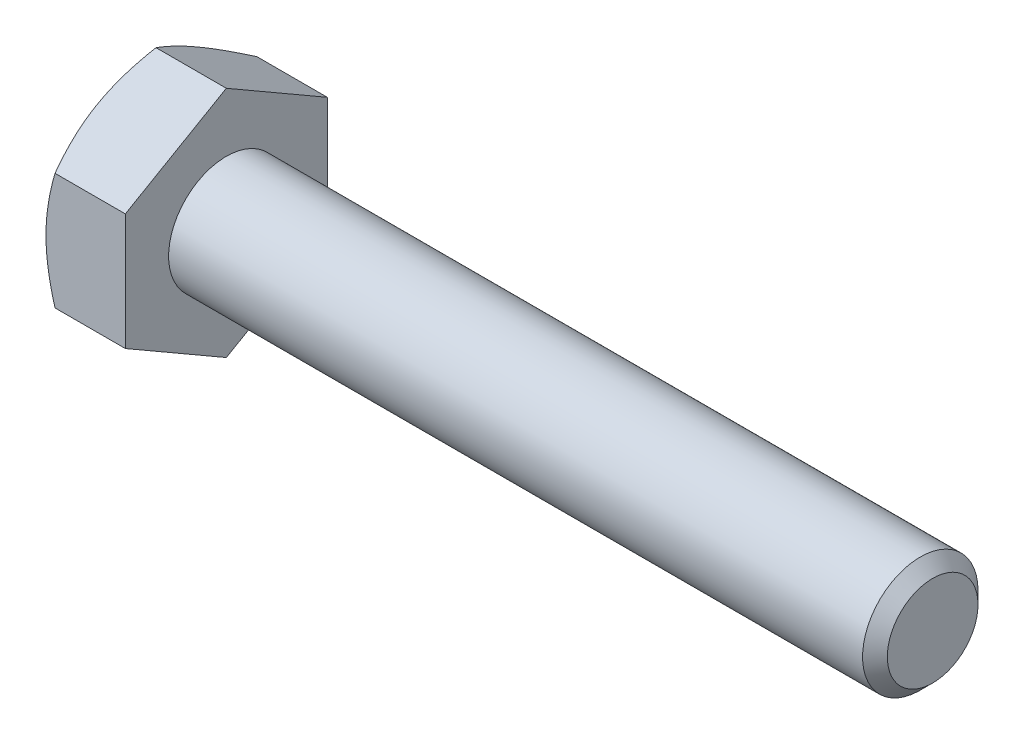
ISO-10303-21;
HEADER;
FILE_DESCRIPTION(('STEP AP214'),'2;1');
FILE_NAME('part.step','',(''),(''),'','','');
FILE_SCHEMA(('AUTOMOTIVE_DESIGN { 1 0 10303 214 1 1 1 1 }'));
ENDSEC;
DATA;
#1=APPLICATION_CONTEXT('core data for automotive mechanical design processes');
#2=APPLICATION_PROTOCOL_DEFINITION('international standard','automotive_design',2000,#1);
#3=PRODUCT_CONTEXT('',#1,'mechanical');
#4=PRODUCT('Part','Part','',(#3));
#5=PRODUCT_RELATED_PRODUCT_CATEGORY('part','',(#4));
#6=PRODUCT_DEFINITION_FORMATION('','',#4);
#7=PRODUCT_DEFINITION_CONTEXT('part definition',#1,'design');
#8=PRODUCT_DEFINITION('design','',#6,#7);
#9=PRODUCT_DEFINITION_SHAPE('','',#8);
#10=(LENGTH_UNIT() NAMED_UNIT(*) SI_UNIT(.MILLI.,.METRE.));
#11=(NAMED_UNIT(*) PLANE_ANGLE_UNIT() SI_UNIT($,.RADIAN.));
#12=(NAMED_UNIT(*) SI_UNIT($,.STERADIAN.) SOLID_ANGLE_UNIT());
#13=UNCERTAINTY_MEASURE_WITH_UNIT(LENGTH_MEASURE(1.E-05),#10,'distance_accuracy_value','');
#14=(GEOMETRIC_REPRESENTATION_CONTEXT(3) GLOBAL_UNCERTAINTY_ASSIGNED_CONTEXT((#13)) GLOBAL_UNIT_ASSIGNED_CONTEXT((#10,
#11,#12)) REPRESENTATION_CONTEXT('',''));
#15=CARTESIAN_POINT('',(0.,0.,0.));
#16=DIRECTION('',(0.,0.,1.));
#17=DIRECTION('',(1.,0.,0.));
#18=AXIS2_PLACEMENT_3D('',#15,#16,#17);
#19=CARTESIAN_POINT('',(-21.6138125,-3.20790243318485,5.55625));
#20=DIRECTION('',(0.,0.,-1.));
#21=DIRECTION('',(0.,1.,0.));
#22=AXIS2_PLACEMENT_3D('',#19,#20,#21);
#23=PLANE('',#22);
#24=CARTESIAN_POINT('',(-18.8403750574616,-8.74399028271723,5.55625));
#25=CARTESIAN_POINT('',(-18.9591476439003,-8.50018624433214,5.55625));
#26=CARTESIAN_POINT('',(-19.0768174877412,-8.25583594838017,5.55625));
#27=CARTESIAN_POINT('',(-19.3093338302931,-7.76575276181023,5.55625));
#28=CARTESIAN_POINT('',(-19.424179907504,-7.5200196714312,5.55625));
#29=CARTESIAN_POINT('',(-19.6509815650906,-7.02567502758554,5.55625));
#30=CARTESIAN_POINT('',(-19.7629190754759,-6.77705515601886,5.55625));
#31=CARTESIAN_POINT('',(-19.9823791438231,-6.2778816135969,5.55625));
#32=CARTESIAN_POINT('',(-20.0899019023311,-6.02732803119864,5.55625));
#33=CARTESIAN_POINT('',(-20.302906896146,-5.51539046667091,5.55625));
#34=CARTESIAN_POINT('',(-20.4081977000269,-5.25392641272659,5.55625));
#35=CARTESIAN_POINT('',(-20.6111139851458,-4.72798657849261,5.55625));
#36=CARTESIAN_POINT('',(-20.7087386244234,-4.46351047103702,5.55625));
#37=CARTESIAN_POINT('',(-20.8938532154484,-3.93158169041599,5.55625));
#38=CARTESIAN_POINT('',(-20.9813626154158,-3.66413585057298,5.55625));
#39=CARTESIAN_POINT('',(-21.1435224423586,-3.12540698347401,5.55625));
#40=CARTESIAN_POINT('',(-21.218176786064,-2.85412515234023,5.55625));
#41=CARTESIAN_POINT('',(-21.3507361578849,-2.30908269853905,5.55625));
#42=CARTESIAN_POINT('',(-21.4087346690236,-2.03534517245375,5.55625));
#43=CARTESIAN_POINT('',(-21.5047733322196,-1.48429809984412,5.55625));
#44=CARTESIAN_POINT('',(-21.542815646564,-1.20698894364918,5.55625));
#45=CARTESIAN_POINT('',(-21.5823928026956,-0.791294728945891,5.55625));
#46=CARTESIAN_POINT('',(-21.592658902021,-0.653708209357037,5.55625));
#47=CARTESIAN_POINT('',(-21.607362187288,-0.378228688137559,5.55625));
#48=CARTESIAN_POINT('',(-21.6117999263983,-0.240335716836742,5.55625));
#49=CARTESIAN_POINT('',(-21.6147354775687,0.0355251316508551,5.55625));
#50=CARTESIAN_POINT('',(-21.6132327727923,0.173493014310985,5.55625));
#51=CARTESIAN_POINT('',(-21.6043265100424,0.449228447033502,5.55625));
#52=CARTESIAN_POINT('',(-21.5969231814189,0.586996004673774,5.55625));
#53=CARTESIAN_POINT('',(-21.5724869355163,0.914267817860307,5.55625));
#54=CARTESIAN_POINT('',(-21.5528672237309,1.10358331302688,5.55625));
#55=CARTESIAN_POINT('',(-21.5035268119308,1.48088314390515,5.55625));
#56=CARTESIAN_POINT('',(-21.4738048473206,1.66886730995275,5.55625));
#57=CARTESIAN_POINT('',(-21.3710555513119,2.23056094001761,5.55625));
#58=CARTESIAN_POINT('',(-21.2844606125147,2.60182550045218,5.55625));
#59=CARTESIAN_POINT('',(-21.1333261053987,3.1572572910348,5.55625));
#60=CARTESIAN_POINT('',(-21.0786586113424,3.34427702524158,5.55625));
#61=CARTESIAN_POINT('',(-20.963406052333,3.71650215163137,5.55625));
#62=CARTESIAN_POINT('',(-20.9028209419117,3.90170752986172,5.55625));
#63=CARTESIAN_POINT('',(-20.7767250457604,4.27035971442929,5.55625));
#64=CARTESIAN_POINT('',(-20.7112156550753,4.45380700235123,5.55625));
#65=CARTESIAN_POINT('',(-20.5760659129719,4.81916376783227,5.55625));
#66=CARTESIAN_POINT('',(-20.5064256552842,5.00107328017708,5.55625));
#67=CARTESIAN_POINT('',(-20.3140333948252,5.48965634412822,5.55625));
#68=CARTESIAN_POINT('',(-20.1880472750788,5.79505516029649,5.55625));
#69=CARTESIAN_POINT('',(-19.9286962832958,6.40271511827116,5.55625));
#70=CARTESIAN_POINT('',(-19.7953305993156,6.7049759104509,5.55625));
#71=CARTESIAN_POINT('',(-19.5229631126131,7.30707795631466,5.55625));
#72=CARTESIAN_POINT('',(-19.3839591769931,7.60691824193362,5.55625));
#73=CARTESIAN_POINT('',(-19.1016603632321,8.20455030388994,5.55625));
#74=CARTESIAN_POINT('',(-18.9583656584325,8.50234216238502,5.55625));
#75=CARTESIAN_POINT('',(-18.668187083384,9.09675870347433,5.55625));
#76=CARTESIAN_POINT('',(-18.5212978378226,9.39338075659061,5.55625));
#77=CARTESIAN_POINT('',(-18.2248414750758,9.98528417706332,5.55625));
#78=CARTESIAN_POINT('',(-18.0752743357868,10.2805655333282,5.55625));
#79=CARTESIAN_POINT('',(-17.6234394244542,11.1646418998589,5.55625));
#80=CARTESIAN_POINT('',(-17.3179729994491,11.7518013892495,5.55625));
#81=CARTESIAN_POINT('',(-16.7338679574184,12.8613257589912,5.55625));
#82=CARTESIAN_POINT('',(-16.4557985829024,13.3839917749348,5.55625));
#83=CARTESIAN_POINT('',(-15.8963014266466,14.4275635287064,5.55625));
#84=CARTESIAN_POINT('',(-15.6148734397935,14.9484691565073,5.55625));
#85=CARTESIAN_POINT('',(-15.0504769924016,15.9871873035495,5.55625));
#86=CARTESIAN_POINT('',(-14.7675168337456,16.5050043408021,5.55625));
#87=CARTESIAN_POINT('',(-14.1996898642822,17.5395393833806,5.55625));
#88=CARTESIAN_POINT('',(-13.9148232052306,18.0562574719669,5.55625));
#89=CARTESIAN_POINT('',(-13.62926235051,18.5725892213169,5.55625));
#90=B_SPLINE_CURVE_WITH_KNOTS('',3,(#24,#25,#26,#27,#28,#29,#30,#31,#32,#33,#34,#35,#36,#37,#38,
#39,#40,#41,#42,#43,#44,#45,#46,#47,#48,#49,#50,#51,#52,#53,#54,#55,#56,#57,#58,#59,#60,#61,#62,
#63,#64,#65,#66,#67,#68,#69,#70,#71,#72,#73,#74,#75,#76,#77,#78,#79,#80,#81,#82,#83,#84,#85,#86,
#87,#88,#89),.UNSPECIFIED.,.F.,.F.,(4,2,2,2,2,2,2,2,2,2,2,2,2,2,2,2,2,2,2,2,2,2,2,2,2,2,2,2,2,2,
2,2,4),(0.,0.813597716445731,1.62731614919359,2.44525275827226,3.26315217028693,
4.10866348233596,4.95426752580812,5.79821771718855,6.64191031370898,7.48077064504381,
8.3195400656786,8.73334238532055,9.14710542821065,9.56090447051723,9.97468742974186,
10.545356138106,11.1160963088496,12.258134229421,12.842619474887,13.4271092116055,
14.0114339823823,14.5957454997084,15.5866951993033,16.5777541467498,17.5691915643882,
18.5605889831377,19.5535724737812,20.5465641644216,22.5321054869691,24.3081902186865,
26.0843839782317,27.8546363211013,29.6247493906644),.UNSPECIFIED.);
#91=CARTESIAN_POINT('',(-21.1175482665182,-3.20790243318485,5.55625));
#92=VERTEX_POINT('',#91);
#93=CARTESIAN_POINT('',(-21.6138125,0.,5.55625));
#94=VERTEX_POINT('',#93);
#95=EDGE_CURVE('E283',#92,#94,#90,.T.);
#96=ORIENTED_EDGE('',*,*,#95,.F.);
#97=DIRECTION('',(1.,0.,0.));
#98=VECTOR('',#97,1.);
#99=CARTESIAN_POINT('',(-21.6138125,-3.20790243318485,5.55625));
#100=LINE('',#99,#98);
#101=CARTESIAN_POINT('',(-17.2481875,-3.20790243318485,5.55625));
#102=VERTEX_POINT('',#101);
#103=EDGE_CURVE('E286',#92,#102,#100,.T.);
#104=ORIENTED_EDGE('',*,*,#103,.T.);
#105=DIRECTION('',(0.,1.,0.));
#106=VECTOR('',#105,1.);
#107=CARTESIAN_POINT('',(-17.2481875,-3.20790243318485,5.55625));
#108=LINE('',#107,#106);
#109=CARTESIAN_POINT('',(-17.2481875,3.20790243318486,5.55625));
#110=VERTEX_POINT('',#109);
#111=EDGE_CURVE('E289',#102,#110,#108,.T.);
#112=ORIENTED_EDGE('',*,*,#111,.T.);
#113=DIRECTION('',(1.,0.,0.));
#114=VECTOR('',#113,1.);
#115=CARTESIAN_POINT('',(-21.6138125,3.20790243318486,5.55625));
#116=LINE('',#115,#114);
#117=CARTESIAN_POINT('',(-21.1175482665182,3.20790243318486,5.55625));
#118=VERTEX_POINT('',#117);
#119=EDGE_CURVE('E245',#118,#110,#116,.T.);
#120=ORIENTED_EDGE('',*,*,#119,.F.);
#121=EDGE_CURVE('E122',#94,#118,#90,.T.);
#122=ORIENTED_EDGE('',*,*,#121,.F.);
#123=EDGE_LOOP('',(#96,#104,#112,#120,#122));
#124=FACE_BOUND('',#123,.T.);
#125=ADVANCED_FACE('F45',(#124),#23,.F.);
#126=CARTESIAN_POINT('',(-21.6138125,3.20790243318486,5.55625));
#127=DIRECTION('',(0.,-0.866025403784439,-0.5));
#128=DIRECTION('',(0.,0.5,-0.866025403784439));
#129=AXIS2_PLACEMENT_3D('',#126,#127,#128);
#130=PLANE('',#129);
#131=CARTESIAN_POINT('',(-21.1174815980518,3.20778696313102,5.55645));
#132=CARTESIAN_POINT('',(-21.1581869396287,3.27830048099899,5.43431700443227));
#133=CARTESIAN_POINT('',(-21.1970449606368,3.34907690760433,5.31172863757365));
#134=CARTESIAN_POINT('',(-21.2705575665754,3.49120454378004,5.06555635055764));
#135=CARTESIAN_POINT('',(-21.3052103381981,3.56255598725623,4.94197202526351));
#136=CARTESIAN_POINT('',(-21.4021806144389,3.7777527611819,4.56924027919934));
#137=CARTESIAN_POINT('',(-21.457336445498,3.92244755263586,4.3186215488105));
#138=CARTESIAN_POINT('',(-21.522013595153,4.13898067940738,3.94357517172046));
#139=CARTESIAN_POINT('',(-21.5404383296374,4.21017202280889,3.82026814788997));
#140=CARTESIAN_POINT('',(-21.5713341337596,4.35287639627881,3.57309692257778));
#141=CARTESIAN_POINT('',(-21.583805729438,4.42438939736052,3.44923277130254));
#142=CARTESIAN_POINT('',(-21.6024774134017,4.56753961185542,3.20128932668298));
#143=CARTESIAN_POINT('',(-21.6086846193166,4.63917659144933,3.07721043832556));
#144=CARTESIAN_POINT('',(-21.6147010825862,4.7825127822332,2.82894487332451));
#145=CARTESIAN_POINT('',(-21.6145105375727,4.85421199143242,2.70475820012895));
#146=CARTESIAN_POINT('',(-21.6051942573071,5.05064720059278,2.36452243746779));
#147=CARTESIAN_POINT('',(-21.5895528403106,5.1753189069971,2.14858470770919));
#148=CARTESIAN_POINT('',(-21.5399525950254,5.42383425573454,1.71814349723526));
#149=CARTESIAN_POINT('',(-21.5059768117333,5.54767702400135,1.50364153044716));
#150=CARTESIAN_POINT('',(-21.4210467499519,5.79669255822861,1.07233397329164));
#151=CARTESIAN_POINT('',(-21.3697326119579,5.92183390122649,0.855582809091896));
#152=CARTESIAN_POINT('',(-21.2532700447076,6.17025031750736,0.425312954659246));
#153=CARTESIAN_POINT('',(-21.1881489741206,6.29352857247572,0.21178875358562));
#154=CARTESIAN_POINT('',(-21.1174815980518,6.41592033642355,-0.000200000000000869));
#155=B_SPLINE_CURVE_WITH_KNOTS('',3,(#131,#132,#133,#134,#135,#136,#137,#138,#139,#140,#141,
#142,#143,#144,#145,#146,#147,#148,#149,#150,#151,#152,#153,#154),.UNSPECIFIED.,.F.,.F.,(4,2,2,
2,2,2,2,2,2,2,2,4),(0.,0.440316908268041,0.880823012040823,1.76366572331169,2.19427472390783,
2.62484566732156,3.05492684132792,3.4849947297767,4.23370964386675,4.98311813377593,
5.74914806559356,6.51367405016872),.UNSPECIFIED.);
#156=CARTESIAN_POINT('',(-21.6138125,4.81185364977729,2.778125));
#157=VERTEX_POINT('',#156);
#158=EDGE_CURVE('E118',#118,#157,#155,.T.);
#159=ORIENTED_EDGE('',*,*,#158,.F.);
#160=ORIENTED_EDGE('',*,*,#119,.T.);
#161=DIRECTION('',(0.,0.5,-0.866025403784439));
#162=VECTOR('',#161,1.);
#163=CARTESIAN_POINT('',(-17.2481875,3.20790243318486,5.55625));
#164=LINE('',#163,#162);
#165=CARTESIAN_POINT('',(-17.2481875,6.41580486636971,0.));
#166=VERTEX_POINT('',#165);
#167=EDGE_CURVE('E313',#110,#166,#164,.T.);
#168=ORIENTED_EDGE('',*,*,#167,.T.);
#169=DIRECTION('',(1.,0.,0.));
#170=VECTOR('',#169,1.);
#171=CARTESIAN_POINT('',(-21.6138125,6.41580486636971,0.));
#172=LINE('',#171,#170);
#173=CARTESIAN_POINT('',(-21.1175482665182,6.41580486636971,0.));
#174=VERTEX_POINT('',#173);
#175=EDGE_CURVE('E143',#174,#166,#172,.T.);
#176=ORIENTED_EDGE('',*,*,#175,.F.);
#177=EDGE_CURVE('E127',#157,#174,#155,.T.);
#178=ORIENTED_EDGE('',*,*,#177,.F.);
#179=EDGE_LOOP('',(#159,#160,#168,#176,#178));
#180=FACE_BOUND('',#179,.T.);
#181=ADVANCED_FACE('F141',(#180),#130,.F.);
#182=CARTESIAN_POINT('',(-21.6138125,6.41580486636971,0.));
#183=DIRECTION('',(0.,-0.866025403784439,0.5));
#184=DIRECTION('',(0.,-0.5,-0.866025403784439));
#185=AXIS2_PLACEMENT_3D('',#182,#183,#184);
#186=PLANE('',#185);
#187=CARTESIAN_POINT('',(-21.1174815980518,6.41592033642355,0.000199999999998423));
#188=CARTESIAN_POINT('',(-21.1581869396287,6.34540681855559,-0.121932995567732));
#189=CARTESIAN_POINT('',(-21.1970449606368,6.27463039195025,-0.244521362426354));
#190=CARTESIAN_POINT('',(-21.2705575665754,6.13250275577453,-0.490693649442357));
#191=CARTESIAN_POINT('',(-21.3052103381981,6.06115131229835,-0.614277974736489));
#192=CARTESIAN_POINT('',(-21.4021806144389,5.84595453837268,-0.987009720800664));
#193=CARTESIAN_POINT('',(-21.457336445498,5.70125974691872,-1.2376284511895));
#194=CARTESIAN_POINT('',(-21.522013595153,5.48472662014719,-1.61267482827954));
#195=CARTESIAN_POINT('',(-21.5404383296374,5.41353527674569,-1.73598185211002));
#196=CARTESIAN_POINT('',(-21.5713341337596,5.27083090327576,-1.98315307742222));
#197=CARTESIAN_POINT('',(-21.583805729438,5.19931790219406,-2.10701722869746));
#198=CARTESIAN_POINT('',(-21.6024774134017,5.05616768769915,-2.35496067331702));
#199=CARTESIAN_POINT('',(-21.6086846193166,4.98453070810525,-2.47903956167444));
#200=CARTESIAN_POINT('',(-21.6147010825862,4.84119451732137,-2.72730512667549));
#201=CARTESIAN_POINT('',(-21.6145105375727,4.76949530812215,-2.85149179987105));
#202=CARTESIAN_POINT('',(-21.6051942573071,4.5730600989618,-3.19172756253221));
#203=CARTESIAN_POINT('',(-21.5895528403106,4.44838839255747,-3.40766529229081));
#204=CARTESIAN_POINT('',(-21.5399525950254,4.19987304382004,-3.83810650276474));
#205=CARTESIAN_POINT('',(-21.5059768117333,4.07603027555323,-4.05260846955284));
#206=CARTESIAN_POINT('',(-21.4210467499519,3.82701474132597,-4.48391602670836));
#207=CARTESIAN_POINT('',(-21.3697326119579,3.70187339832808,-4.7006671909081));
#208=CARTESIAN_POINT('',(-21.2532700447076,3.45345698204721,-5.13093704534075));
#209=CARTESIAN_POINT('',(-21.1881489741206,3.33017872707885,-5.34446124641438));
#210=CARTESIAN_POINT('',(-21.1174815980518,3.20778696313102,-5.55645));
#211=B_SPLINE_CURVE_WITH_KNOTS('',3,(#187,#188,#189,#190,#191,#192,#193,#194,#195,#196,#197,
#198,#199,#200,#201,#202,#203,#204,#205,#206,#207,#208,#209,#210),.UNSPECIFIED.,.F.,.F.,(4,2,2,
2,2,2,2,2,2,2,2,4),(0.,0.440316908268041,0.880823012040822,1.76366572331169,2.19427472390783,
2.62484566732156,3.05492684132792,3.48499472977669,4.23370964386674,4.98311813377592,
5.74914806559356,6.51367405016872),.UNSPECIFIED.);
#212=CARTESIAN_POINT('',(-21.6138125,4.81185364977729,-2.778125));
#213=VERTEX_POINT('',#212);
#214=EDGE_CURVE('E132',#174,#213,#211,.T.);
#215=ORIENTED_EDGE('',*,*,#214,.F.);
#216=ORIENTED_EDGE('',*,*,#175,.T.);
#217=DIRECTION('',(0.,-0.5,-0.866025403784439));
#218=VECTOR('',#217,1.);
#219=CARTESIAN_POINT('',(-17.2481875,6.41580486636971,0.));
#220=LINE('',#219,#218);
#221=CARTESIAN_POINT('',(-17.2481875,3.20790243318486,-5.55625));
#222=VERTEX_POINT('',#221);
#223=EDGE_CURVE('E310',#166,#222,#220,.T.);
#224=ORIENTED_EDGE('',*,*,#223,.T.);
#225=DIRECTION('',(1.,0.,0.));
#226=VECTOR('',#225,1.);
#227=CARTESIAN_POINT('',(-21.6138125,3.20790243318486,-5.55625));
#228=LINE('',#227,#226);
#229=CARTESIAN_POINT('',(-21.1175482665182,3.20790243318486,-5.55625));
#230=VERTEX_POINT('',#229);
#231=EDGE_CURVE('E305',#230,#222,#228,.T.);
#232=ORIENTED_EDGE('',*,*,#231,.F.);
#233=EDGE_CURVE('E146',#213,#230,#211,.T.);
#234=ORIENTED_EDGE('',*,*,#233,.F.);
#235=EDGE_LOOP('',(#215,#216,#224,#232,#234));
#236=FACE_BOUND('',#235,.T.);
#237=ADVANCED_FACE('F207',(#236),#186,.F.);
#238=CARTESIAN_POINT('',(-21.6138125,3.20790243318486,-5.55625));
#239=DIRECTION('',(0.,0.,1.));
#240=DIRECTION('',(0.,-1.,0.));
#241=AXIS2_PLACEMENT_3D('',#238,#239,#240);
#242=PLANE('',#241);
#243=CARTESIAN_POINT('',(-18.8403750598475,-8.74399027782085,-5.55624999999999));
#244=CARTESIAN_POINT('',(-18.9591476461868,-8.50018623960062,-5.55624999999999));
#245=CARTESIAN_POINT('',(-19.0768174899284,-8.25583594381362,-5.55624999999999));
#246=CARTESIAN_POINT('',(-19.309333832282,-7.76575275757412,-5.55624999999999));
#247=CARTESIAN_POINT('',(-19.424179909394,-7.52001966736056,-5.55624999999999));
#248=CARTESIAN_POINT('',(-19.6509815667827,-7.02567502384834,-5.55624999999999));
#249=CARTESIAN_POINT('',(-19.7629190770691,-6.77705515244963,-5.55624999999999));
#250=CARTESIAN_POINT('',(-19.9823791452201,-6.27788161036475,-5.55624999999999));
#251=CARTESIAN_POINT('',(-20.0899019036307,-6.02732802813559,-5.55624999999999));
#252=CARTESIAN_POINT('',(-20.3029068972481,-5.51539046395943,-5.55624999999999));
#253=CARTESIAN_POINT('',(-20.408197701029,-5.25392641019769,-5.55624999999999));
#254=CARTESIAN_POINT('',(-20.6111139859531,-4.72798657633179,-5.55624999999999));
#255=CARTESIAN_POINT('',(-20.7087386251359,-4.46351046906169,-5.55624999999999));
#256=CARTESIAN_POINT('',(-20.8938532159805,-3.93158168881508,-5.55624999999999));
#257=CARTESIAN_POINT('',(-20.9813626158621,-3.66413584916098,-5.55624999999999));
#258=CARTESIAN_POINT('',(-21.1435224426472,-3.12540698244495,-5.55624999999999));
#259=CARTESIAN_POINT('',(-21.2181767862806,-2.8541251515052,-5.55624999999999));
#260=CARTESIAN_POINT('',(-21.3507361579561,-2.30908269819076,-5.55624999999999));
#261=CARTESIAN_POINT('',(-21.4087346690269,-2.03534517239951,-5.55624999999999));
#262=CARTESIAN_POINT('',(-21.5047733321313,-1.4842981003853,-5.55624999999999));
#263=CARTESIAN_POINT('',(-21.5428156464521,-1.20698894449172,-5.55625));
#264=CARTESIAN_POINT('',(-21.5823928025883,-0.791294730238441,-5.55625));
#265=CARTESIAN_POINT('',(-21.5926589019217,-0.653708210797406,-5.55625));
#266=CARTESIAN_POINT('',(-21.6073621872177,-0.378228689873301,-5.55625));
#267=CARTESIAN_POINT('',(-21.6117999263492,-0.240335718720038,-5.55625));
#268=CARTESIAN_POINT('',(-21.6147354775746,0.0355251294734955,-5.55625));
#269=CARTESIAN_POINT('',(-21.6132327728321,0.173493011987115,-5.55625));
#270=CARTESIAN_POINT('',(-21.604326510162,0.449228444418533,-5.55625));
#271=CARTESIAN_POINT('',(-21.5969231815845,0.586996001914218,-5.55625));
#272=CARTESIAN_POINT('',(-21.5724869357947,0.914267814878999,-5.55625));
#273=CARTESIAN_POINT('',(-21.5528672240741,1.10358330996903,-5.55625));
#274=CARTESIAN_POINT('',(-21.503526812407,1.48088314069774,-5.55625));
#275=CARTESIAN_POINT('',(-21.4738048478651,1.66886730667231,-5.55625));
#276=CARTESIAN_POINT('',(-21.3710555520625,2.23056093652212,-5.55625));
#277=CARTESIAN_POINT('',(-21.2844606134045,2.60182549681905,-5.55625));
#278=CARTESIAN_POINT('',(-21.1333261064939,3.15725728719582,-5.55625));
#279=CARTESIAN_POINT('',(-21.0786586125065,3.34427702133249,-5.55625));
#280=CARTESIAN_POINT('',(-20.9634060536328,3.71650214758286,-5.55625));
#281=CARTESIAN_POINT('',(-20.9028209432783,3.9017075257439,-5.55625));
#282=CARTESIAN_POINT('',(-20.7767250472581,4.27035971017337,-5.55625));
#283=CARTESIAN_POINT('',(-20.7112156566373,4.45380699802653,-5.55625));
#284=CARTESIAN_POINT('',(-20.5760659146603,4.81916376337001,-5.55625));
#285=CARTESIAN_POINT('',(-20.5064256570347,5.00107327564603,-5.55625));
#286=CARTESIAN_POINT('',(-20.3140333966823,5.48965633955827,-5.55625));
#287=CARTESIAN_POINT('',(-20.1880472769738,5.7950551557544,-5.55625));
#288=CARTESIAN_POINT('',(-19.9286962852557,6.40271511378119,-5.55625));
#289=CARTESIAN_POINT('',(-19.7953306013023,6.7049759059852,-5.55625));
#290=CARTESIAN_POINT('',(-19.5229631146457,7.3070779518949,-5.55625));
#291=CARTESIAN_POINT('',(-19.3839591790448,7.60691823753553,-5.55625));
#292=CARTESIAN_POINT('',(-19.1016603653161,8.20455029953285,-5.55625));
#293=CARTESIAN_POINT('',(-18.9583656605298,8.50234215804726,-5.55625));
#294=CARTESIAN_POINT('',(-18.6681870855033,9.09675869917466,-5.55625));
#295=CARTESIAN_POINT('',(-18.5212978399505,9.3933807523097,-5.55625));
#296=CARTESIAN_POINT('',(-18.224841477218,9.9852841728185,-5.55625));
#297=CARTESIAN_POINT('',(-18.0752743379345,10.2805655291007,-5.55625));
#298=CARTESIAN_POINT('',(-17.6234394266152,11.1646418956815,-5.55625));
#299=CARTESIAN_POINT('',(-17.3179730016145,11.7518013851031,-5.55625));
#300=CARTESIAN_POINT('',(-16.7338679596005,12.8613257548756,-5.55625));
#301=CARTESIAN_POINT('',(-16.4557985850974,13.3839917708193,-5.55625));
#302=CARTESIAN_POINT('',(-15.896301428865,14.42756352459,-5.55625));
#303=CARTESIAN_POINT('',(-15.6148734420222,14.9484691523898,-5.55625));
#304=CARTESIAN_POINT('',(-15.0504769946515,15.9871872994245,-5.55625));
#305=CARTESIAN_POINT('',(-14.7675168360065,16.5050043366708,-5.55625));
#306=CARTESIAN_POINT('',(-14.1996898665637,17.5395393792358,-5.55625));
#307=CARTESIAN_POINT('',(-13.9148232075218,18.056257467815,-5.55625));
#308=CARTESIAN_POINT('',(-13.6292623528106,18.5725892171576,-5.55625));
#309=B_SPLINE_CURVE_WITH_KNOTS('',3,(#243,#244,#245,#246,#247,#248,#249,#250,#251,#252,#253,
#254,#255,#256,#257,#258,#259,#260,#261,#262,#263,#264,#265,#266,#267,#268,#269,#270,#271,#272,
#273,#274,#275,#276,#277,#278,#279,#280,#281,#282,#283,#284,#285,#286,#287,#288,#289,#290,#291,
#292,#293,#294,#295,#296,#297,#298,#299,#300,#301,#302,#303,#304,#305,#306,#307,#308),
.UNSPECIFIED.,.F.,.F.,(4,2,2,2,2,2,2,2,2,2,2,2,2,2,2,2,2,2,2,2,2,2,2,2,2,2,2,2,2,2,2,2,4),(0.,
0.813597715870461,1.62731614804298,2.4452527565403,3.26315216797367,4.10866347940256,
4.95426752225437,5.79821771301645,6.64191030891902,7.48077063935046,8.31954005908317,
8.73334237828505,9.14710542073519,9.56090446260156,9.97468742138602,10.5453561295019,
11.1160962999972,12.2581342200709,12.8426194652768,13.4271092017353,14.0114339722529,
14.5957454893196,15.5866951889479,16.5777541364282,17.5691915541016,18.5605889728859,
19.5535724635683,20.5465641542476,22.5321054768716,24.308190208571,26.0843839680985,
27.8546363109357,29.624749380466),.UNSPECIFIED.);
#310=CARTESIAN_POINT('',(-21.6138125,0.,-5.55625));
#311=VERTEX_POINT('',#310);
#312=EDGE_CURVE('E201',#230,#311,#309,.F.);
#313=ORIENTED_EDGE('',*,*,#312,.F.);
#314=ORIENTED_EDGE('',*,*,#231,.T.);
#315=DIRECTION('',(0.,-1.,0.));
#316=VECTOR('',#315,1.);
#317=CARTESIAN_POINT('',(-17.2481875,3.20790243318486,-5.55625));
#318=LINE('',#317,#316);
#319=CARTESIAN_POINT('',(-17.2481875,-3.20790243318486,-5.55624999999999));
#320=VERTEX_POINT('',#319);
#321=EDGE_CURVE('E318',#222,#320,#318,.T.);
#322=ORIENTED_EDGE('',*,*,#321,.T.);
#323=DIRECTION('',(1.,0.,0.));
#324=VECTOR('',#323,1.);
#325=CARTESIAN_POINT('',(-21.6138125,-3.20790243318486,-5.55624999999999));
#326=LINE('',#325,#324);
#327=CARTESIAN_POINT('',(-21.1175482665182,-3.20790243318486,-5.55624999999999));
#328=VERTEX_POINT('',#327);
#329=EDGE_CURVE('E267',#328,#320,#326,.T.);
#330=ORIENTED_EDGE('',*,*,#329,.F.);
#331=EDGE_CURVE('E194',#311,#328,#309,.F.);
#332=ORIENTED_EDGE('',*,*,#331,.F.);
#333=EDGE_LOOP('',(#313,#314,#322,#330,#332));
#334=FACE_BOUND('',#333,.T.);
#335=ADVANCED_FACE('F203',(#334),#242,.F.);
#336=CARTESIAN_POINT('',(-21.6138125,-3.20790243318486,-5.55624999999999));
#337=DIRECTION('',(0.,0.866025403784439,0.5));
#338=DIRECTION('',(0.,-0.5,0.866025403784439));
#339=AXIS2_PLACEMENT_3D('',#336,#337,#338);
#340=PLANE('',#339);
#341=CARTESIAN_POINT('',(-21.1174815980518,-3.20778696313102,-5.55644999999999));
#342=CARTESIAN_POINT('',(-21.1581869396287,-3.27830048099898,-5.43431700443226));
#343=CARTESIAN_POINT('',(-21.1970449606368,-3.34907690760432,-5.31172863757364));
#344=CARTESIAN_POINT('',(-21.2705575665754,-3.49120454378004,-5.06555635055764));
#345=CARTESIAN_POINT('',(-21.3052103381981,-3.56255598725622,-4.94197202526351));
#346=CARTESIAN_POINT('',(-21.4021806144389,-3.7777527611819,-4.56924027919933));
#347=CARTESIAN_POINT('',(-21.457336445498,-3.92244755263585,-4.31862154881049));
#348=CARTESIAN_POINT('',(-21.522013595153,-4.13898067940738,-3.94357517172046));
#349=CARTESIAN_POINT('',(-21.5404383296374,-4.21017202280888,-3.82026814788997));
#350=CARTESIAN_POINT('',(-21.5713341337596,-4.35287639627881,-3.57309692257778));
#351=CARTESIAN_POINT('',(-21.583805729438,-4.42438939736051,-3.44923277130254));
#352=CARTESIAN_POINT('',(-21.6024774134017,-4.56753961185542,-3.20128932668298));
#353=CARTESIAN_POINT('',(-21.6086846193166,-4.63917659144932,-3.07721043832556));
#354=CARTESIAN_POINT('',(-21.6147010825862,-4.7825127822332,-2.82894487332451));
#355=CARTESIAN_POINT('',(-21.6145105375727,-4.85421199143242,-2.70475820012895));
#356=CARTESIAN_POINT('',(-21.6051942573071,-5.05064720059277,-2.36452243746779));
#357=CARTESIAN_POINT('',(-21.5895528403106,-5.1753189069971,-2.14858470770919));
#358=CARTESIAN_POINT('',(-21.5399525950254,-5.42383425573453,-1.71814349723526));
#359=CARTESIAN_POINT('',(-21.5059768117333,-5.54767702400134,-1.50364153044716));
#360=CARTESIAN_POINT('',(-21.4210467499519,-5.7966925582286,-1.07233397329164));
#361=CARTESIAN_POINT('',(-21.3697326119579,-5.92183390122649,-0.855582809091897));
#362=CARTESIAN_POINT('',(-21.2532700447076,-6.17025031750736,-0.425312954659247));
#363=CARTESIAN_POINT('',(-21.1881489741206,-6.29352857247572,-0.21178875358562));
#364=CARTESIAN_POINT('',(-21.1174815980518,-6.41592033642355,0.00020000000000014));
#365=B_SPLINE_CURVE_WITH_KNOTS('',3,(#341,#342,#343,#344,#345,#346,#347,#348,#349,#350,#351,
#352,#353,#354,#355,#356,#357,#358,#359,#360,#361,#362,#363,#364),.UNSPECIFIED.,.F.,.F.,(4,2,2,
2,2,2,2,2,2,2,2,4),(0.,0.44031690826804,0.880823012040823,1.76366572331169,2.19427472390783,
2.62484566732156,3.05492684132791,3.48499472977669,4.23370964386674,4.98311813377593,
5.74914806559356,6.51367405016872),.UNSPECIFIED.);
#366=CARTESIAN_POINT('',(-21.6138125,-4.81185364977729,-2.778125));
#367=VERTEX_POINT('',#366);
#368=EDGE_CURVE('E202',#328,#367,#365,.T.);
#369=ORIENTED_EDGE('',*,*,#368,.F.);
#370=ORIENTED_EDGE('',*,*,#329,.T.);
#371=DIRECTION('',(0.,-0.5,0.866025403784439));
#372=VECTOR('',#371,1.);
#373=CARTESIAN_POINT('',(-17.2481875,-3.20790243318486,-5.55624999999999));
#374=LINE('',#373,#372);
#375=CARTESIAN_POINT('',(-17.2481875,-6.41580486636971,0.));
#376=VERTEX_POINT('',#375);
#377=EDGE_CURVE('E299',#320,#376,#374,.T.);
#378=ORIENTED_EDGE('',*,*,#377,.T.);
#379=DIRECTION('',(1.,0.,0.));
#380=VECTOR('',#379,1.);
#381=CARTESIAN_POINT('',(-21.6138125,-6.41580486636971,0.));
#382=LINE('',#381,#380);
#383=CARTESIAN_POINT('',(-21.1175482665182,-6.41580486636971,0.));
#384=VERTEX_POINT('',#383);
#385=EDGE_CURVE('E294',#384,#376,#382,.T.);
#386=ORIENTED_EDGE('',*,*,#385,.F.);
#387=EDGE_CURVE('E188',#367,#384,#365,.T.);
#388=ORIENTED_EDGE('',*,*,#387,.F.);
#389=EDGE_LOOP('',(#369,#370,#378,#386,#388));
#390=FACE_BOUND('',#389,.T.);
#391=ADVANCED_FACE('F206',(#390),#340,.F.);
#392=CARTESIAN_POINT('',(-21.6138125,-6.41580486636971,0.));
#393=DIRECTION('',(0.,0.866025403784439,-0.5));
#394=DIRECTION('',(0.,0.5,0.866025403784439));
#395=AXIS2_PLACEMENT_3D('',#392,#393,#394);
#396=PLANE('',#395);
#397=CARTESIAN_POINT('',(-21.1174815980518,-6.41592033642355,-0.000200000000000443));
#398=CARTESIAN_POINT('',(-21.1581869396287,-6.34540681855558,0.12193299556773));
#399=CARTESIAN_POINT('',(-21.1970449606368,-6.27463039195024,0.244521362426352));
#400=CARTESIAN_POINT('',(-21.2705575665754,-6.13250275577453,0.490693649442355));
#401=CARTESIAN_POINT('',(-21.3052103381981,-6.06115131229834,0.614277974736486));
#402=CARTESIAN_POINT('',(-21.4021806144389,-5.84595453837267,0.98700972080066));
#403=CARTESIAN_POINT('',(-21.457336445498,-5.70125974691871,1.2376284511895));
#404=CARTESIAN_POINT('',(-21.522013595153,-5.48472662014719,1.61267482827954));
#405=CARTESIAN_POINT('',(-21.5404383296374,-5.41353527674569,1.73598185211002));
#406=CARTESIAN_POINT('',(-21.5713341337596,-5.27083090327576,1.98315307742221));
#407=CARTESIAN_POINT('',(-21.583805729438,-5.19931790219405,2.10701722869746));
#408=CARTESIAN_POINT('',(-21.6024774134017,-5.05616768769915,2.35496067331701));
#409=CARTESIAN_POINT('',(-21.6086846193166,-4.98453070810524,2.47903956167444));
#410=CARTESIAN_POINT('',(-21.6147010825862,-4.84119451732137,2.72730512667549));
#411=CARTESIAN_POINT('',(-21.6145105375727,-4.76949530812215,2.85149179987105));
#412=CARTESIAN_POINT('',(-21.6051942573071,-4.5730600989618,3.1917275625322));
#413=CARTESIAN_POINT('',(-21.5895528403106,-4.44838839255747,3.40766529229081));
#414=CARTESIAN_POINT('',(-21.5399525950254,-4.19987304382004,3.83810650276474));
#415=CARTESIAN_POINT('',(-21.5059768117333,-4.07603027555322,4.05260846955284));
#416=CARTESIAN_POINT('',(-21.4210467499519,-3.82701474132596,4.48391602670836));
#417=CARTESIAN_POINT('',(-21.3697326119579,-3.70187339832808,4.7006671909081));
#418=CARTESIAN_POINT('',(-21.2532700447076,-3.45345698204721,5.13093704534075));
#419=CARTESIAN_POINT('',(-21.1881489741206,-3.33017872707885,5.34446124641438));
#420=CARTESIAN_POINT('',(-21.1174815980518,-3.20778696313102,5.55645));
#421=B_SPLINE_CURVE_WITH_KNOTS('',3,(#397,#398,#399,#400,#401,#402,#403,#404,#405,#406,#407,
#408,#409,#410,#411,#412,#413,#414,#415,#416,#417,#418,#419,#420),.UNSPECIFIED.,.F.,.F.,(4,2,2,
2,2,2,2,2,2,2,2,4),(0.,0.44031690826804,0.880823012040822,1.76366572331169,2.19427472390783,
2.62484566732156,3.05492684132792,3.48499472977669,4.23370964386675,4.98311813377593,
5.74914806559356,6.51367405016873),.UNSPECIFIED.);
#422=CARTESIAN_POINT('',(-21.6138125,-4.81185364977728,2.778125));
#423=VERTEX_POINT('',#422);
#424=EDGE_CURVE('E276',#384,#423,#421,.T.);
#425=ORIENTED_EDGE('',*,*,#424,.F.);
#426=ORIENTED_EDGE('',*,*,#385,.T.);
#427=DIRECTION('',(0.,0.5,0.866025403784439));
#428=VECTOR('',#427,1.);
#429=CARTESIAN_POINT('',(-17.2481875,-6.41580486636971,0.));
#430=LINE('',#429,#428);
#431=EDGE_CURVE('E291',#376,#102,#430,.T.);
#432=ORIENTED_EDGE('',*,*,#431,.T.);
#433=ORIENTED_EDGE('',*,*,#103,.F.);
#434=EDGE_CURVE('E138',#423,#92,#421,.T.);
#435=ORIENTED_EDGE('',*,*,#434,.F.);
#436=EDGE_LOOP('',(#425,#426,#432,#433,#435));
#437=FACE_BOUND('',#436,.T.);
#438=ADVANCED_FACE('F229',(#437),#396,.F.);
#439=CARTESIAN_POINT('',(-17.2481875,0.,0.));
#440=DIRECTION('',(1.,0.,0.));
#441=DIRECTION('',(0.,0.,-1.));
#442=AXIS2_PLACEMENT_3D('',#439,#440,#441);
#443=CYLINDRICAL_SURFACE('',#442,3.175);
#444=CARTESIAN_POINT('',(20.9334553571483,0.,0.));
#445=DIRECTION('',(1.,0.,0.));
#446=DIRECTION('',(0.,0.,-1.));
#447=AXIS2_PLACEMENT_3D('',#444,#445,#446);
#448=CIRCLE('',#447,3.175);
#449=CARTESIAN_POINT('',(20.9334553571483,0.,-3.175));
#450=VERTEX_POINT('',#449);
#451=EDGE_CURVE('E238',#450,#450,#448,.F.);
#452=CARTESIAN_POINT('',(-17.2481875,0.,0.));
#453=DIRECTION('',(-1.,0.,0.));
#454=DIRECTION('',(0.,0.,1.));
#455=AXIS2_PLACEMENT_3D('',#452,#453,#454);
#456=CIRCLE('',#455,3.175);
#457=CARTESIAN_POINT('',(-17.2481875,0.,-3.175));
#458=VERTEX_POINT('',#457);
#459=EDGE_CURVE('E241',#458,#458,#456,.F.);
#460=CARTESIAN_POINT('',(20.9334553571483,0.,-3.175));
#461=CARTESIAN_POINT('',(20.5357299107197,0.,-3.175));
#462=CARTESIAN_POINT('',(20.1380044642911,0.,-3.175));
#463=CARTESIAN_POINT('',(19.3425535714338,0.,-3.175));
#464=CARTESIAN_POINT('',(18.9448281250052,0.,-3.175));
#465=CARTESIAN_POINT('',(18.1493772321479,0.,-3.175));
#466=CARTESIAN_POINT('',(17.7516517857193,0.,-3.175));
#467=CARTESIAN_POINT('',(16.956200892862,0.,-3.175));
#468=CARTESIAN_POINT('',(16.5584754464334,0.,-3.175));
#469=CARTESIAN_POINT('',(15.7630245535761,0.,-3.175));
#470=CARTESIAN_POINT('',(15.3652991071475,0.,-3.175));
#471=CARTESIAN_POINT('',(14.5698482142903,0.,-3.175));
#472=CARTESIAN_POINT('',(14.1721227678616,0.,-3.175));
#473=CARTESIAN_POINT('',(13.3766718750044,0.,-3.175));
#474=CARTESIAN_POINT('',(12.9789464285757,0.,-3.175));
#475=CARTESIAN_POINT('',(12.1834955357185,0.,-3.175));
#476=CARTESIAN_POINT('',(11.7857700892899,0.,-3.175));
#477=CARTESIAN_POINT('',(10.9903191964326,0.,-3.175));
#478=CARTESIAN_POINT('',(10.592593750004,0.,-3.175));
#479=CARTESIAN_POINT('',(9.79714285714672,0.,-3.175));
#480=CARTESIAN_POINT('',(9.39941741071809,0.,-3.175));
#481=CARTESIAN_POINT('',(8.60396651786083,0.,-3.175));
#482=CARTESIAN_POINT('',(8.2062410714322,0.,-3.175));
#483=CARTESIAN_POINT('',(7.41079017857495,0.,-3.175));
#484=CARTESIAN_POINT('',(7.01306473214632,0.,-3.175));
#485=CARTESIAN_POINT('',(6.21761383928906,0.,-3.175));
#486=CARTESIAN_POINT('',(5.81988839286043,0.,-3.175));
#487=CARTESIAN_POINT('',(5.02443750000318,0.,-3.175));
#488=CARTESIAN_POINT('',(4.62671205357455,0.,-3.175));
#489=CARTESIAN_POINT('',(3.83126116071729,0.,-3.175));
#490=CARTESIAN_POINT('',(3.43353571428866,0.,-3.175));
#491=CARTESIAN_POINT('',(2.63808482143141,0.,-3.175));
#492=CARTESIAN_POINT('',(2.24035937500278,0.,-3.175));
#493=CARTESIAN_POINT('',(1.44490848214552,0.,-3.175));
#494=CARTESIAN_POINT('',(1.04718303571689,0.,-3.175));
#495=CARTESIAN_POINT('',(0.251732142859638,0.,-3.175));
#496=CARTESIAN_POINT('',(-0.14599330356899,0.,-3.175));
#497=CARTESIAN_POINT('',(-0.941444196426246,0.,-3.175));
#498=CARTESIAN_POINT('',(-1.33916964285487,0.,-3.175));
#499=CARTESIAN_POINT('',(-2.13462053571213,0.,-3.175));
#500=CARTESIAN_POINT('',(-2.53234598214076,0.,-3.175));
#501=CARTESIAN_POINT('',(-3.32779687499801,0.,-3.175));
#502=CARTESIAN_POINT('',(-3.72552232142664,0.,-3.175));
#503=CARTESIAN_POINT('',(-4.5209732142839,0.,-3.175));
#504=CARTESIAN_POINT('',(-4.91869866071253,0.,-3.175));
#505=CARTESIAN_POINT('',(-5.71414955356978,0.,-3.175));
#506=CARTESIAN_POINT('',(-6.11187499999841,0.,-3.175));
#507=CARTESIAN_POINT('',(-6.90732589285567,0.,-3.175));
#508=CARTESIAN_POINT('',(-7.3050513392843,0.,-3.175));
#509=CARTESIAN_POINT('',(-8.10050223214155,0.,-3.175));
#510=CARTESIAN_POINT('',(-8.49822767857018,0.,-3.175));
#511=CARTESIAN_POINT('',(-9.29367857142744,0.,-3.175));
#512=CARTESIAN_POINT('',(-9.69140401785607,0.,-3.175));
#513=CARTESIAN_POINT('',(-10.4868549107133,0.,-3.175));
#514=CARTESIAN_POINT('',(-10.884580357142,0.,-3.175));
#515=CARTESIAN_POINT('',(-11.6800312499992,0.,-3.175));
#516=CARTESIAN_POINT('',(-12.0777566964278,0.,-3.175));
#517=CARTESIAN_POINT('',(-12.8732075892851,0.,-3.175));
#518=CARTESIAN_POINT('',(-13.2709330357137,0.,-3.175));
#519=CARTESIAN_POINT('',(-14.066383928571,0.,-3.175));
#520=CARTESIAN_POINT('',(-14.4641093749996,0.,-3.175));
#521=CARTESIAN_POINT('',(-15.2595602678569,0.,-3.175));
#522=CARTESIAN_POINT('',(-15.6572857142855,0.,-3.175));
#523=CARTESIAN_POINT('',(-16.4527366071427,0.,-3.175));
#524=CARTESIAN_POINT('',(-16.8504620535714,0.,-3.175));
#525=CARTESIAN_POINT('',(-17.2481875,0.,-3.175));
#526=B_SPLINE_CURVE_WITH_KNOTS('',3,(#460,#461,#462,#463,#464,#465,#466,#467,#468,#469,#470,
#471,#472,#473,#474,#475,#476,#477,#478,#479,#480,#481,#482,#483,#484,#485,#486,#487,#488,#489,
#490,#491,#492,#493,#494,#495,#496,#497,#498,#499,#500,#501,#502,#503,#504,#505,#506,#507,#508,
#509,#510,#511,#512,#513,#514,#515,#516,#517,#518,#519,#520,#521,#522,#523,#524,#525),
.UNSPECIFIED.,.F.,.F.,(4,2,2,2,2,2,2,2,2,2,2,2,2,2,2,2,2,2,2,2,2,2,2,2,2,2,2,2,2,2,2,2,4),(0.,
1.19317633928588,2.38635267857177,3.57952901785766,4.77270535714354,5.96588169642942,
7.15905803571531,8.35223437500119,9.54541071428707,10.738587053573,11.9317633928588,
13.1249397321447,14.3181160714306,15.5112924107165,16.7044687500024,17.8976450892883,
19.0908214285742,20.28399776786,21.4771741071459,22.6703504464318,23.8635267857177,
25.0567031250036,26.2498794642895,27.4430558035753,28.6362321428612,29.8294084821471,
31.022584821433,32.2157611607189,33.4089375000048,34.6021138392906,35.7952901785765,
36.9884665178624,38.1816428571483),.UNSPECIFIED.);
#527=EDGE_CURVE('BSEAM226',#450,#458,#526,.T.);
#528=ORIENTED_EDGE('',*,*,#451,.T.);
#529=ORIENTED_EDGE('',*,*,#459,.T.);
#530=ORIENTED_EDGE('',*,*,#527,.T.);
#531=ORIENTED_EDGE('',*,*,#527,.F.);
#532=EDGE_LOOP('',(#528,#530,#529,#531));
#533=FACE_BOUND('',#532,.T.);
#534=ADVANCED_FACE('F226',(#533),#443,.T.);
#535=CARTESIAN_POINT('',(21.6138125,0.,0.));
#536=DIRECTION('',(1.,0.,0.));
#537=DIRECTION('',(0.,0.,-1.));
#538=AXIS2_PLACEMENT_3D('',#535,#536,#537);
#539=PLANE('',#538);
#540=CARTESIAN_POINT('',(21.6138125,0.,0.));
#541=DIRECTION('',(1.,0.,0.));
#542=DIRECTION('',(0.,0.,-1.));
#543=AXIS2_PLACEMENT_3D('',#540,#541,#542);
#544=CIRCLE('',#543,2.49464285714831);
#545=CARTESIAN_POINT('',(21.6138125,0.,-2.49464285714831));
#546=VERTEX_POINT('',#545);
#547=EDGE_CURVE('E244',#546,#546,#544,.T.);
#548=ORIENTED_EDGE('',*,*,#547,.T.);
#549=EDGE_LOOP('',(#548));
#550=FACE_BOUND('',#549,.T.);
#551=ADVANCED_FACE('F224',(#550),#539,.T.);
#552=CARTESIAN_POINT('',(21.6138125,0.,0.));
#553=DIRECTION('',(-1.,0.,0.));
#554=DIRECTION('',(0.,0.,1.));
#555=AXIS2_PLACEMENT_3D('',#552,#553,#554);
#556=CONICAL_SURFACE('',#555,2.49464285714831,0.785398163397451);
#557=ORIENTED_EDGE('',*,*,#451,.F.);
#558=EDGE_LOOP('',(#557));
#559=FACE_BOUND('',#558,.T.);
#560=ORIENTED_EDGE('',*,*,#547,.F.);
#561=EDGE_LOOP('',(#560));
#562=FACE_BOUND('',#561,.T.);
#563=ADVANCED_FACE('F47',(#559,#562),#556,.T.);
#564=CARTESIAN_POINT('',(-17.2481875,3.20790243318486,5.55625));
#565=DIRECTION('',(-1.,0.,0.));
#566=DIRECTION('',(0.,0.,1.));
#567=AXIS2_PLACEMENT_3D('',#564,#565,#566);
#568=PLANE('',#567);
#569=ORIENTED_EDGE('',*,*,#459,.F.);
#570=EDGE_LOOP('',(#569));
#571=FACE_BOUND('',#570,.T.);
#572=ORIENTED_EDGE('',*,*,#111,.F.);
#573=ORIENTED_EDGE('',*,*,#431,.F.);
#574=ORIENTED_EDGE('',*,*,#377,.F.);
#575=ORIENTED_EDGE('',*,*,#321,.F.);
#576=ORIENTED_EDGE('',*,*,#223,.F.);
#577=ORIENTED_EDGE('',*,*,#167,.F.);
#578=EDGE_LOOP('',(#572,#573,#574,#575,#576,#577));
#579=FACE_BOUND('',#578,.T.);
#580=ADVANCED_FACE('F173',(#571,#579),#568,.F.);
#581=CARTESIAN_POINT('',(-21.6138125,0.,0.));
#582=DIRECTION('',(1.,0.,0.));
#583=DIRECTION('',(0.,0.,1.));
#584=AXIS2_PLACEMENT_3D('',#581,#582,#583);
#585=CONICAL_SURFACE('',#584,5.55625,1.0471975511966);
#586=ORIENTED_EDGE('',*,*,#95,.T.);
#587=CARTESIAN_POINT('',(-21.6138125,0.,0.));
#588=DIRECTION('',(-1.,0.,0.));
#589=DIRECTION('',(0.,0.,1.));
#590=AXIS2_PLACEMENT_3D('',#587,#588,#589);
#591=CIRCLE('',#590,5.55625);
#592=EDGE_CURVE('E49',#423,#94,#591,.T.);
#593=ORIENTED_EDGE('',*,*,#592,.F.);
#594=ORIENTED_EDGE('',*,*,#434,.T.);
#595=EDGE_LOOP('',(#586,#593,#594));
#596=FACE_BOUND('',#595,.T.);
#597=ADVANCED_FACE('F168',(#596),#585,.T.);
#598=ORIENTED_EDGE('',*,*,#387,.T.);
#599=ORIENTED_EDGE('',*,*,#424,.T.);
#600=EDGE_CURVE('E70',#367,#423,#591,.T.);
#601=ORIENTED_EDGE('',*,*,#600,.F.);
#602=EDGE_LOOP('',(#598,#599,#601));
#603=FACE_BOUND('',#602,.T.);
#604=ADVANCED_FACE('F172',(#603),#585,.T.);
#605=ORIENTED_EDGE('',*,*,#331,.T.);
#606=ORIENTED_EDGE('',*,*,#368,.T.);
#607=EDGE_CURVE('E256',#311,#367,#591,.T.);
#608=ORIENTED_EDGE('',*,*,#607,.F.);
#609=EDGE_LOOP('',(#605,#606,#608));
#610=FACE_BOUND('',#609,.T.);
#611=ADVANCED_FACE('F270',(#610),#585,.T.);
#612=ORIENTED_EDGE('',*,*,#233,.T.);
#613=ORIENTED_EDGE('',*,*,#312,.T.);
#614=EDGE_CURVE('E55',#213,#311,#591,.T.);
#615=ORIENTED_EDGE('',*,*,#614,.F.);
#616=EDGE_LOOP('',(#612,#613,#615));
#617=FACE_BOUND('',#616,.T.);
#618=ADVANCED_FACE('F328',(#617),#585,.T.);
#619=ORIENTED_EDGE('',*,*,#177,.T.);
#620=ORIENTED_EDGE('',*,*,#214,.T.);
#621=EDGE_CURVE('E12',#157,#213,#591,.T.);
#622=ORIENTED_EDGE('',*,*,#621,.F.);
#623=EDGE_LOOP('',(#619,#620,#622));
#624=FACE_BOUND('',#623,.T.);
#625=ADVANCED_FACE('F130',(#624),#585,.T.);
#626=ORIENTED_EDGE('',*,*,#121,.T.);
#627=ORIENTED_EDGE('',*,*,#158,.T.);
#628=CARTESIAN_POINT('',(-21.6138125,0.,0.));
#629=DIRECTION('',(-1.,0.,0.));
#630=DIRECTION('',(0.,0.,1.));
#631=AXIS2_PLACEMENT_3D('',#628,#629,#630);
#632=CIRCLE('',#631,5.55625);
#633=EDGE_CURVE('E62',#94,#157,#632,.T.);
#634=ORIENTED_EDGE('',*,*,#633,.F.);
#635=EDGE_LOOP('',(#626,#627,#634));
#636=FACE_BOUND('',#635,.T.);
#637=ADVANCED_FACE('F120',(#636),#585,.T.);
#638=CARTESIAN_POINT('',(-21.6138125,3.20790243318486,5.55625));
#639=DIRECTION('',(-1.,0.,0.));
#640=DIRECTION('',(0.,0.,1.));
#641=AXIS2_PLACEMENT_3D('',#638,#639,#640);
#642=PLANE('',#641);
#643=ORIENTED_EDGE('',*,*,#592,.T.);
#644=ORIENTED_EDGE('',*,*,#633,.T.);
#645=ORIENTED_EDGE('',*,*,#621,.T.);
#646=ORIENTED_EDGE('',*,*,#614,.T.);
#647=ORIENTED_EDGE('',*,*,#607,.T.);
#648=ORIENTED_EDGE('',*,*,#600,.T.);
#649=EDGE_LOOP('',(#643,#644,#645,#646,#647,#648));
#650=FACE_BOUND('',#649,.T.);
#651=ADVANCED_FACE('F136',(#650),#642,.T.);
#652=CLOSED_SHELL('',(#125,#181,#237,#335,#391,#438,#534,#551,#563,#580,#597,#604,#611,#618,
#625,#637,#651));
#653=MANIFOLD_SOLID_BREP('B2',#652);
#654=ADVANCED_BREP_SHAPE_REPRESENTATION('',(#18,#653),#14);
#655=SHAPE_DEFINITION_REPRESENTATION(#9,#654);
ENDSEC;
END-ISO-10303-21;
